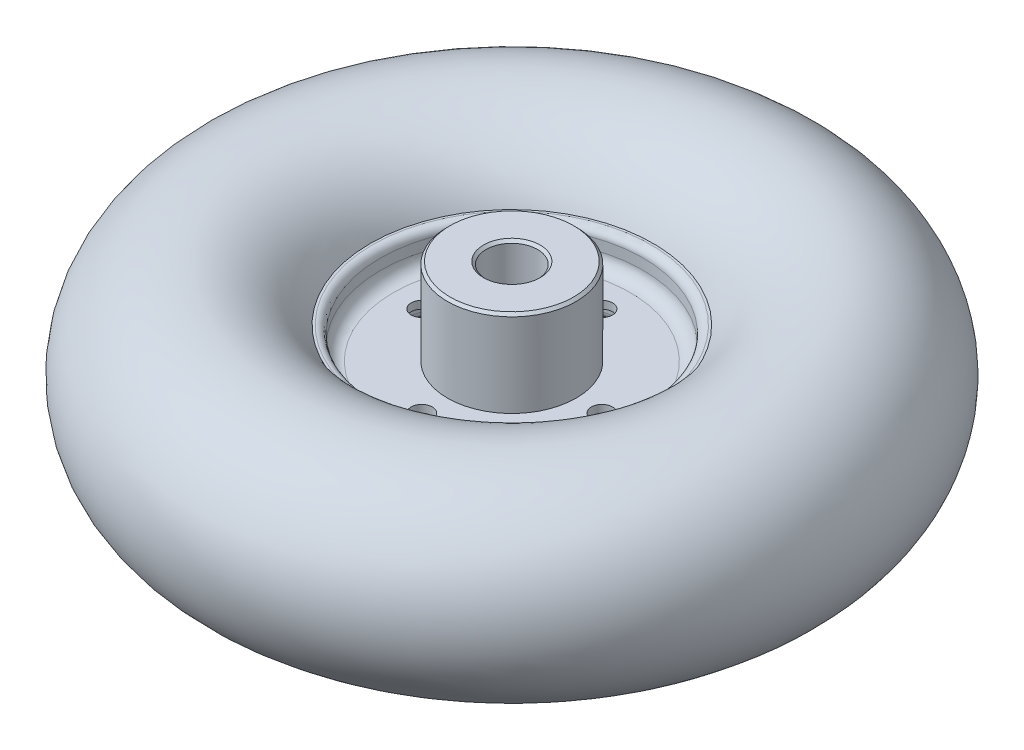
ISO-10303-21;
HEADER;
FILE_DESCRIPTION(('STEP AP214'),'2;1');
FILE_NAME('part.step','',(''),(''),'','','');
FILE_SCHEMA(('AUTOMOTIVE_DESIGN { 1 0 10303 214 1 1 1 1 }'));
ENDSEC;
DATA;
#1=APPLICATION_CONTEXT('core data for automotive mechanical design processes');
#2=APPLICATION_PROTOCOL_DEFINITION('international standard','automotive_design',2000,#1);
#3=PRODUCT_CONTEXT('',#1,'mechanical');
#4=PRODUCT('Part','Part','',(#3));
#5=PRODUCT_RELATED_PRODUCT_CATEGORY('part','',(#4));
#6=PRODUCT_DEFINITION_FORMATION('','',#4);
#7=PRODUCT_DEFINITION_CONTEXT('part definition',#1,'design');
#8=PRODUCT_DEFINITION('design','',#6,#7);
#9=PRODUCT_DEFINITION_SHAPE('','',#8);
#10=(LENGTH_UNIT() NAMED_UNIT(*) SI_UNIT(.MILLI.,.METRE.));
#11=(NAMED_UNIT(*) PLANE_ANGLE_UNIT() SI_UNIT($,.RADIAN.));
#12=(NAMED_UNIT(*) SI_UNIT($,.STERADIAN.) SOLID_ANGLE_UNIT());
#13=UNCERTAINTY_MEASURE_WITH_UNIT(LENGTH_MEASURE(1.E-05),#10,'distance_accuracy_value','');
#14=(GEOMETRIC_REPRESENTATION_CONTEXT(3) GLOBAL_UNCERTAINTY_ASSIGNED_CONTEXT((#13)) GLOBAL_UNIT_ASSIGNED_CONTEXT((#10,
#11,#12)) REPRESENTATION_CONTEXT('',''));
#15=CARTESIAN_POINT('',(0.,0.,0.));
#16=DIRECTION('',(0.,0.,1.));
#17=DIRECTION('',(1.,0.,0.));
#18=AXIS2_PLACEMENT_3D('',#15,#16,#17);
#19=CARTESIAN_POINT('',(0.,-9.86771125565815,0.));
#20=DIRECTION('',(0.,1.,0.));
#21=DIRECTION('',(-1.,0.,0.));
#22=AXIS2_PLACEMENT_3D('',#19,#20,#21);
#23=TOROIDAL_SURFACE('',#22,89.5,38.5);
#24=CARTESIAN_POINT('',(0.,6.94623348181655,0.));
#25=DIRECTION('',(0.,-1.,0.));
#26=DIRECTION('',(-1.,0.,0.));
#27=AXIS2_PLACEMENT_3D('',#24,#25,#26);
#28=CIRCLE('',#27,54.8656057889683);
#29=CARTESIAN_POINT('',(-54.8656057889684,6.94623348181654,0.));
#30=VERTEX_POINT('',#29);
#31=EDGE_CURVE('E85',#30,#30,#28,.T.);
#32=ORIENTED_EDGE('',*,*,#31,.T.);
#33=EDGE_LOOP('',(#32));
#34=FACE_BOUND('',#33,.T.);
#35=CARTESIAN_POINT('',(0.,-23.0537665181834,0.));
#36=DIRECTION('',(0.,-1.,0.));
#37=DIRECTION('',(-1.,0.,0.));
#38=AXIS2_PLACEMENT_3D('',#35,#36,#37);
#39=CIRCLE('',#38,53.3284926134723);
#40=CARTESIAN_POINT('',(-53.3284926134723,-23.0537665181834,0.));
#41=VERTEX_POINT('',#40);
#42=EDGE_CURVE('E82',#41,#41,#39,.T.);
#43=ORIENTED_EDGE('',*,*,#42,.F.);
#44=EDGE_LOOP('',(#43));
#45=FACE_BOUND('',#44,.T.);
#46=ADVANCED_FACE('F35',(#34,#45),#23,.T.);
#47=CARTESIAN_POINT('',(0.,6.94623348181656,0.));
#48=DIRECTION('',(0.,1.,0.));
#49=DIRECTION('',(-1.,0.,0.));
#50=AXIS2_PLACEMENT_3D('',#47,#48,#49);
#51=PLANE('',#50);
#52=CARTESIAN_POINT('',(0.,6.94623348181656,0.));
#53=DIRECTION('',(0.,-1.,0.));
#54=DIRECTION('',(-1.,0.,0.));
#55=AXIS2_PLACEMENT_3D('',#52,#53,#54);
#56=CIRCLE('',#55,54.0000000000001);
#57=CARTESIAN_POINT('',(-54.0000000000001,6.94623348181655,0.));
#58=VERTEX_POINT('',#57);
#59=EDGE_CURVE('E94',#58,#58,#56,.F.);
#60=ORIENTED_EDGE('',*,*,#59,.F.);
#61=EDGE_LOOP('',(#60));
#62=FACE_BOUND('',#61,.T.);
#63=ORIENTED_EDGE('',*,*,#31,.F.);
#64=EDGE_LOOP('',(#63));
#65=FACE_BOUND('',#64,.T.);
#66=ADVANCED_FACE('F147',(#62,#65),#51,.T.);
#67=CARTESIAN_POINT('',(0.,112.941993013574,0.));
#68=DIRECTION('',(0.,1.,0.));
#69=DIRECTION('',(-1.,0.,0.));
#70=AXIS2_PLACEMENT_3D('',#67,#68,#69);
#71=CYLINDRICAL_SURFACE('',#70,51.0000000000001);
#72=CARTESIAN_POINT('',(0.,-0.173002613538517,0.));
#73=DIRECTION('',(0.,-1.,0.));
#74=DIRECTION('',(-1.,0.,0.));
#75=AXIS2_PLACEMENT_3D('',#72,#73,#74);
#76=CIRCLE('',#75,51.0000000000001);
#77=CARTESIAN_POINT('',(-51.0000000000001,-0.173002613538527,0.));
#78=VERTEX_POINT('',#77);
#79=EDGE_CURVE('E81',#78,#78,#76,.F.);
#80=ORIENTED_EDGE('',*,*,#79,.F.);
#81=EDGE_LOOP('',(#80));
#82=FACE_BOUND('',#81,.T.);
#83=CARTESIAN_POINT('',(0.,3.94623348181657,0.));
#84=DIRECTION('',(0.,-1.,0.));
#85=DIRECTION('',(-1.,0.,0.));
#86=AXIS2_PLACEMENT_3D('',#83,#84,#85);
#87=CIRCLE('',#86,51.0000000000001);
#88=CARTESIAN_POINT('',(-51.0000000000001,3.94623348181656,0.));
#89=VERTEX_POINT('',#88);
#90=EDGE_CURVE('E91',#89,#89,#87,.T.);
#91=ORIENTED_EDGE('',*,*,#90,.F.);
#92=EDGE_LOOP('',(#91));
#93=FACE_BOUND('',#92,.T.);
#94=ADVANCED_FACE('F153',(#82,#93),#71,.F.);
#95=CARTESIAN_POINT('',(0.,-5.17300261353851,0.));
#96=DIRECTION('',(0.,1.,0.));
#97=DIRECTION('',(-1.,0.,0.));
#98=AXIS2_PLACEMENT_3D('',#95,#96,#97);
#99=PLANE('',#98);
#100=CARTESIAN_POINT('',(3.67589083805939E-13,-5.17300261353851,-35.));
#101=DIRECTION('',(0.,-1.,0.));
#102=DIRECTION('',(0.,0.,1.));
#103=AXIS2_PLACEMENT_3D('',#100,#101,#102);
#104=CIRCLE('',#103,4.1);
#105=CARTESIAN_POINT('',(3.24643863338169E-13,-5.17300261353851,-30.9));
#106=VERTEX_POINT('',#105);
#107=EDGE_CURVE('E72',#106,#106,#104,.T.);
#108=ORIENTED_EDGE('',*,*,#107,.T.);
#109=EDGE_LOOP('',(#108));
#110=FACE_BOUND('',#109,.T.);
#111=CARTESIAN_POINT('',(-35.,-5.17300261353852,0.));
#112=DIRECTION('',(0.,-1.,0.));
#113=DIRECTION('',(1.,0.,0.));
#114=AXIS2_PLACEMENT_3D('',#111,#112,#113);
#115=CIRCLE('',#114,4.1);
#116=CARTESIAN_POINT('',(-30.9,-5.17300261353852,0.));
#117=VERTEX_POINT('',#116);
#118=EDGE_CURVE('E62',#117,#117,#115,.T.);
#119=ORIENTED_EDGE('',*,*,#118,.T.);
#120=EDGE_LOOP('',(#119));
#121=FACE_BOUND('',#120,.T.);
#122=CARTESIAN_POINT('',(-1.21218303632099E-13,-5.17300261353851,35.));
#123=DIRECTION('',(0.,-1.,0.));
#124=DIRECTION('',(0.,0.,-1.));
#125=AXIS2_PLACEMENT_3D('',#122,#123,#124);
#126=CIRCLE('',#125,4.1);
#127=CARTESIAN_POINT('',(-1.06903230142842E-13,-5.17300261353851,30.9));
#128=VERTEX_POINT('',#127);
#129=EDGE_CURVE('E59',#128,#128,#126,.T.);
#130=ORIENTED_EDGE('',*,*,#129,.T.);
#131=EDGE_LOOP('',(#130));
#132=FACE_BOUND('',#131,.T.);
#133=CARTESIAN_POINT('',(35.,-5.17300261353851,0.));
#134=DIRECTION('',(0.,-1.,0.));
#135=DIRECTION('',(-1.,0.,0.));
#136=AXIS2_PLACEMENT_3D('',#133,#134,#135);
#137=CIRCLE('',#136,4.1);
#138=CARTESIAN_POINT('',(30.9,-5.17300261353851,0.));
#139=VERTEX_POINT('',#138);
#140=EDGE_CURVE('E56',#139,#139,#137,.T.);
#141=ORIENTED_EDGE('',*,*,#140,.T.);
#142=EDGE_LOOP('',(#141));
#143=FACE_BOUND('',#142,.T.);
#144=CARTESIAN_POINT('',(0.,-5.17300261353851,0.));
#145=DIRECTION('',(0.,-1.,0.));
#146=DIRECTION('',(-1.,0.,0.));
#147=AXIS2_PLACEMENT_3D('',#144,#145,#146);
#148=CIRCLE('',#147,25.);
#149=CARTESIAN_POINT('',(-25.,-5.17300261353852,0.));
#150=VERTEX_POINT('',#149);
#151=EDGE_CURVE('E77',#150,#150,#148,.T.);
#152=ORIENTED_EDGE('',*,*,#151,.T.);
#153=EDGE_LOOP('',(#152));
#154=FACE_BOUND('',#153,.T.);
#155=CARTESIAN_POINT('',(0.,-5.17300261353851,0.));
#156=DIRECTION('',(0.,-1.,0.));
#157=DIRECTION('',(-1.,0.,0.));
#158=AXIS2_PLACEMENT_3D('',#155,#156,#157);
#159=CIRCLE('',#158,46.0000000000001);
#160=CARTESIAN_POINT('',(-46.0000000000001,-5.17300261353852,0.));
#161=VERTEX_POINT('',#160);
#162=EDGE_CURVE('E103',#161,#161,#159,.T.);
#163=ORIENTED_EDGE('',*,*,#162,.F.);
#164=EDGE_LOOP('',(#163));
#165=FACE_BOUND('',#164,.T.);
#166=ADVANCED_FACE('F200',(#110,#121,#132,#143,#154,#165),#99,.T.);
#167=CARTESIAN_POINT('',(0.,-8.17300261353851,0.));
#168=DIRECTION('',(0.,1.,0.));
#169=DIRECTION('',(-1.,0.,0.));
#170=AXIS2_PLACEMENT_3D('',#167,#168,#169);
#171=PLANE('',#170);
#172=CARTESIAN_POINT('',(3.68159473945413E-13,-8.17300261353851,-35.));
#173=DIRECTION('',(0.,-1.,0.));
#174=DIRECTION('',(-1.,0.,0.));
#175=AXIS2_PLACEMENT_3D('',#172,#173,#174);
#176=CIRCLE('',#175,4.1);
#177=CARTESIAN_POINT('',(-4.09999999999963,-8.17300261353851,-35.));
#178=VERTEX_POINT('',#177);
#179=EDGE_CURVE('E39',#178,#178,#176,.T.);
#180=ORIENTED_EDGE('',*,*,#179,.F.);
#181=EDGE_LOOP('',(#180));
#182=FACE_BOUND('',#181,.T.);
#183=CARTESIAN_POINT('',(-35.,-8.17300261353852,0.));
#184=DIRECTION('',(0.,-1.,0.));
#185=DIRECTION('',(-1.,0.,0.));
#186=AXIS2_PLACEMENT_3D('',#183,#184,#185);
#187=CIRCLE('',#186,4.1);
#188=CARTESIAN_POINT('',(-39.1,-8.17300261353852,0.));
#189=VERTEX_POINT('',#188);
#190=EDGE_CURVE('E60',#189,#189,#187,.T.);
#191=ORIENTED_EDGE('',*,*,#190,.F.);
#192=EDGE_LOOP('',(#191));
#193=FACE_BOUND('',#192,.T.);
#194=CARTESIAN_POINT('',(-1.20647913492626E-13,-8.17300261353851,35.));
#195=DIRECTION('',(0.,-1.,0.));
#196=DIRECTION('',(-1.,0.,0.));
#197=AXIS2_PLACEMENT_3D('',#194,#195,#196);
#198=CIRCLE('',#197,4.1);
#199=CARTESIAN_POINT('',(-4.10000000000012,-8.17300261353851,35.));
#200=VERTEX_POINT('',#199);
#201=EDGE_CURVE('E57',#200,#200,#198,.T.);
#202=ORIENTED_EDGE('',*,*,#201,.F.);
#203=EDGE_LOOP('',(#202));
#204=FACE_BOUND('',#203,.T.);
#205=CARTESIAN_POINT('',(35.,-8.17300261353851,0.));
#206=DIRECTION('',(0.,-1.,0.));
#207=DIRECTION('',(-1.,0.,0.));
#208=AXIS2_PLACEMENT_3D('',#205,#206,#207);
#209=CIRCLE('',#208,4.1);
#210=CARTESIAN_POINT('',(30.9,-8.17300261353851,0.));
#211=VERTEX_POINT('',#210);
#212=EDGE_CURVE('E52',#211,#211,#209,.T.);
#213=ORIENTED_EDGE('',*,*,#212,.F.);
#214=EDGE_LOOP('',(#213));
#215=FACE_BOUND('',#214,.T.);
#216=CARTESIAN_POINT('',(0.,-8.17300261353851,0.));
#217=DIRECTION('',(0.,-1.,0.));
#218=DIRECTION('',(-1.,0.,0.));
#219=AXIS2_PLACEMENT_3D('',#216,#217,#218);
#220=CIRCLE('',#219,25.);
#221=CARTESIAN_POINT('',(-25.,-8.17300261353852,0.));
#222=VERTEX_POINT('',#221);
#223=EDGE_CURVE('E55',#222,#222,#220,.T.);
#224=ORIENTED_EDGE('',*,*,#223,.F.);
#225=EDGE_LOOP('',(#224));
#226=FACE_BOUND('',#225,.T.);
#227=CARTESIAN_POINT('',(0.,-8.17300261353851,0.));
#228=DIRECTION('',(0.,-1.,0.));
#229=DIRECTION('',(-1.,0.,0.));
#230=AXIS2_PLACEMENT_3D('',#227,#228,#229);
#231=CIRCLE('',#230,46.0000000000001);
#232=CARTESIAN_POINT('',(-46.0000000000001,-8.17300261353852,0.));
#233=VERTEX_POINT('',#232);
#234=EDGE_CURVE('E100',#233,#233,#231,.F.);
#235=ORIENTED_EDGE('',*,*,#234,.F.);
#236=EDGE_LOOP('',(#235));
#237=FACE_BOUND('',#236,.T.);
#238=ADVANCED_FACE('F198',(#182,#193,#204,#215,#226,#237),#171,.F.);
#239=CARTESIAN_POINT('',(0.,-13.1730026135385,0.));
#240=DIRECTION('',(0.,-1.,0.));
#241=DIRECTION('',(-1.,0.,0.));
#242=AXIS2_PLACEMENT_3D('',#239,#240,#241);
#243=CIRCLE('',#242,51.0000000000001);
#244=CARTESIAN_POINT('',(-51.0000000000001,-13.1730026135385,0.));
#245=VERTEX_POINT('',#244);
#246=EDGE_CURVE('E97',#245,#245,#243,.T.);
#247=ORIENTED_EDGE('',*,*,#246,.F.);
#248=EDGE_LOOP('',(#247));
#249=FACE_BOUND('',#248,.T.);
#250=CARTESIAN_POINT('',(0.,-20.1298859067633,0.));
#251=DIRECTION('',(0.,1.,0.));
#252=DIRECTION('',(1.,0.,0.));
#253=AXIS2_PLACEMENT_3D('',#250,#251,#252);
#254=CIRCLE('',#253,51.0000000000001);
#255=CARTESIAN_POINT('',(51.,-20.1298859067633,0.));
#256=VERTEX_POINT('',#255);
#257=EDGE_CURVE('E88',#256,#256,#254,.T.);
#258=ORIENTED_EDGE('',*,*,#257,.F.);
#259=EDGE_LOOP('',(#258));
#260=FACE_BOUND('',#259,.T.);
#261=ADVANCED_FACE('F163',(#249,#260),#71,.F.);
#262=CARTESIAN_POINT('',(0.,-20.1298859067633,0.));
#263=DIRECTION('',(0.,-1.,0.));
#264=DIRECTION('',(1.,0.,0.));
#265=AXIS2_PLACEMENT_3D('',#262,#263,#264);
#266=TOROIDAL_SURFACE('',#265,54.0000000000001,3.);
#267=ORIENTED_EDGE('',*,*,#257,.T.);
#268=EDGE_LOOP('',(#267));
#269=FACE_BOUND('',#268,.T.);
#270=ORIENTED_EDGE('',*,*,#42,.T.);
#271=EDGE_LOOP('',(#270));
#272=FACE_BOUND('',#271,.T.);
#273=ADVANCED_FACE('F159',(#269,#272),#266,.T.);
#274=CARTESIAN_POINT('',(0.,3.94623348181657,0.));
#275=DIRECTION('',(0.,1.,0.));
#276=DIRECTION('',(-1.,0.,0.));
#277=AXIS2_PLACEMENT_3D('',#274,#275,#276);
#278=TOROIDAL_SURFACE('',#277,54.0000000000001,3.);
#279=ORIENTED_EDGE('',*,*,#59,.T.);
#280=EDGE_LOOP('',(#279));
#281=FACE_BOUND('',#280,.T.);
#282=ORIENTED_EDGE('',*,*,#90,.T.);
#283=EDGE_LOOP('',(#282));
#284=FACE_BOUND('',#283,.T.);
#285=ADVANCED_FACE('F162',(#281,#284),#278,.T.);
#286=CARTESIAN_POINT('',(0.,-13.1730026135385,0.));
#287=DIRECTION('',(0.,1.,0.));
#288=DIRECTION('',(-1.,0.,0.));
#289=AXIS2_PLACEMENT_3D('',#286,#287,#288);
#290=TOROIDAL_SURFACE('',#289,46.0000000000001,5.);
#291=ORIENTED_EDGE('',*,*,#234,.T.);
#292=EDGE_LOOP('',(#291));
#293=FACE_BOUND('',#292,.T.);
#294=ORIENTED_EDGE('',*,*,#246,.T.);
#295=EDGE_LOOP('',(#294));
#296=FACE_BOUND('',#295,.T.);
#297=ADVANCED_FACE('F167',(#293,#296),#290,.F.);
#298=CARTESIAN_POINT('',(0.,-0.173002613538517,0.));
#299=DIRECTION('',(0.,1.,0.));
#300=DIRECTION('',(-1.,0.,0.));
#301=AXIS2_PLACEMENT_3D('',#298,#299,#300);
#302=TOROIDAL_SURFACE('',#301,46.0000000000001,5.);
#303=ORIENTED_EDGE('',*,*,#79,.T.);
#304=EDGE_LOOP('',(#303));
#305=FACE_BOUND('',#304,.T.);
#306=ORIENTED_EDGE('',*,*,#162,.T.);
#307=EDGE_LOOP('',(#306));
#308=FACE_BOUND('',#307,.T.);
#309=ADVANCED_FACE('F171',(#305,#308),#302,.F.);
#310=CARTESIAN_POINT('',(0.,28.3269973864615,0.));
#311=DIRECTION('',(0.,-1.,0.));
#312=DIRECTION('',(1.,0.,0.));
#313=AXIS2_PLACEMENT_3D('',#310,#311,#312);
#314=CYLINDRICAL_SURFACE('',#313,25.);
#315=CARTESIAN_POINT('',(0.,-40.6730026135385,0.));
#316=DIRECTION('',(0.,1.,0.));
#317=DIRECTION('',(1.,0.,0.));
#318=AXIS2_PLACEMENT_3D('',#315,#316,#317);
#319=CIRCLE('',#318,25.);
#320=CARTESIAN_POINT('',(25.,-40.6730026135385,0.));
#321=VERTEX_POINT('',#320);
#322=EDGE_CURVE('E121',#321,#321,#319,.F.);
#323=ORIENTED_EDGE('',*,*,#322,.F.);
#324=EDGE_LOOP('',(#323));
#325=FACE_BOUND('',#324,.T.);
#326=ORIENTED_EDGE('',*,*,#223,.T.);
#327=EDGE_LOOP('',(#326));
#328=FACE_BOUND('',#327,.T.);
#329=ADVANCED_FACE('F143',(#325,#328),#314,.T.);
#330=CARTESIAN_POINT('',(0.,-41.6730026135385,0.));
#331=DIRECTION('',(0.,-1.,0.));
#332=DIRECTION('',(1.,0.,0.));
#333=AXIS2_PLACEMENT_3D('',#330,#331,#332);
#334=PLANE('',#333);
#335=CARTESIAN_POINT('',(0.,-41.6730026135385,0.));
#336=DIRECTION('',(0.,1.,0.));
#337=DIRECTION('',(1.,0.,0.));
#338=AXIS2_PLACEMENT_3D('',#335,#336,#337);
#339=CIRCLE('',#338,11.);
#340=CARTESIAN_POINT('',(11.,-41.6730026135385,0.));
#341=VERTEX_POINT('',#340);
#342=EDGE_CURVE('E118',#341,#341,#339,.F.);
#343=ORIENTED_EDGE('',*,*,#342,.F.);
#344=EDGE_LOOP('',(#343));
#345=FACE_BOUND('',#344,.T.);
#346=CARTESIAN_POINT('',(0.,-41.6730026135385,0.));
#347=DIRECTION('',(0.,1.,0.));
#348=DIRECTION('',(1.,0.,0.));
#349=AXIS2_PLACEMENT_3D('',#346,#347,#348);
#350=CIRCLE('',#349,24.);
#351=CARTESIAN_POINT('',(23.9999999999999,-41.6730026135385,0.));
#352=VERTEX_POINT('',#351);
#353=EDGE_CURVE('E115',#352,#352,#350,.T.);
#354=ORIENTED_EDGE('',*,*,#353,.F.);
#355=EDGE_LOOP('',(#354));
#356=FACE_BOUND('',#355,.T.);
#357=ADVANCED_FACE('F189',(#345,#356),#334,.T.);
#358=CARTESIAN_POINT('',(0.,112.941993013574,0.));
#359=DIRECTION('',(0.,1.,0.));
#360=DIRECTION('',(-1.,0.,0.));
#361=AXIS2_PLACEMENT_3D('',#358,#359,#360);
#362=CYLINDRICAL_SURFACE('',#361,10.);
#363=CARTESIAN_POINT('',(0.,-40.6730026135386,0.));
#364=DIRECTION('',(0.,1.,0.));
#365=DIRECTION('',(1.,0.,0.));
#366=AXIS2_PLACEMENT_3D('',#363,#364,#365);
#367=CIRCLE('',#366,10.);
#368=CARTESIAN_POINT('',(10.,-40.6730026135386,0.));
#369=VERTEX_POINT('',#368);
#370=EDGE_CURVE('E112',#369,#369,#367,.T.);
#371=ORIENTED_EDGE('',*,*,#370,.F.);
#372=EDGE_LOOP('',(#371));
#373=FACE_BOUND('',#372,.T.);
#374=CARTESIAN_POINT('',(0.,27.3269973864615,0.));
#375=DIRECTION('',(0.,1.,0.));
#376=DIRECTION('',(1.,0.,0.));
#377=AXIS2_PLACEMENT_3D('',#374,#375,#376);
#378=CIRCLE('',#377,10.);
#379=CARTESIAN_POINT('',(10.,27.3269973864615,0.));
#380=VERTEX_POINT('',#379);
#381=EDGE_CURVE('E80',#380,#380,#378,.F.);
#382=ORIENTED_EDGE('',*,*,#381,.F.);
#383=EDGE_LOOP('',(#382));
#384=FACE_BOUND('',#383,.T.);
#385=ADVANCED_FACE('F140',(#373,#384),#362,.F.);
#386=CARTESIAN_POINT('',(0.,27.3269973864615,0.));
#387=DIRECTION('',(0.,1.,0.));
#388=DIRECTION('',(1.,0.,0.));
#389=AXIS2_PLACEMENT_3D('',#386,#387,#388);
#390=CIRCLE('',#389,25.);
#391=CARTESIAN_POINT('',(25.,27.3269973864615,0.));
#392=VERTEX_POINT('',#391);
#393=EDGE_CURVE('E10',#392,#392,#390,.T.);
#394=ORIENTED_EDGE('',*,*,#393,.F.);
#395=EDGE_LOOP('',(#394));
#396=FACE_BOUND('',#395,.T.);
#397=ORIENTED_EDGE('',*,*,#151,.F.);
#398=EDGE_LOOP('',(#397));
#399=FACE_BOUND('',#398,.T.);
#400=ADVANCED_FACE('F130',(#396,#399),#314,.T.);
#401=CARTESIAN_POINT('',(0.,28.3269973864615,0.));
#402=DIRECTION('',(0.,-1.,0.));
#403=DIRECTION('',(1.,0.,0.));
#404=AXIS2_PLACEMENT_3D('',#401,#402,#403);
#405=PLANE('',#404);
#406=CARTESIAN_POINT('',(0.,28.3269973864615,0.));
#407=DIRECTION('',(0.,1.,0.));
#408=DIRECTION('',(1.,0.,0.));
#409=AXIS2_PLACEMENT_3D('',#406,#407,#408);
#410=CIRCLE('',#409,11.0000000000001);
#411=CARTESIAN_POINT('',(11.0000000000001,28.3269973864615,0.));
#412=VERTEX_POINT('',#411);
#413=EDGE_CURVE('E43',#412,#412,#410,.T.);
#414=ORIENTED_EDGE('',*,*,#413,.F.);
#415=EDGE_LOOP('',(#414));
#416=FACE_BOUND('',#415,.T.);
#417=CARTESIAN_POINT('',(0.,28.3269973864615,0.));
#418=DIRECTION('',(0.,1.,0.));
#419=DIRECTION('',(1.,0.,0.));
#420=AXIS2_PLACEMENT_3D('',#417,#418,#419);
#421=CIRCLE('',#420,23.9999999999999);
#422=CARTESIAN_POINT('',(23.9999999999999,28.3269973864615,0.));
#423=VERTEX_POINT('',#422);
#424=EDGE_CURVE('E48',#423,#423,#421,.F.);
#425=ORIENTED_EDGE('',*,*,#424,.F.);
#426=EDGE_LOOP('',(#425));
#427=FACE_BOUND('',#426,.T.);
#428=ADVANCED_FACE('F127',(#416,#427),#405,.F.);
#429=CARTESIAN_POINT('',(0.,-40.6730026135386,0.));
#430=DIRECTION('',(0.,-1.,0.));
#431=DIRECTION('',(1.,0.,0.));
#432=AXIS2_PLACEMENT_3D('',#429,#430,#431);
#433=CONICAL_SURFACE('',#432,10.,0.785398163397447);
#434=ORIENTED_EDGE('',*,*,#342,.T.);
#435=EDGE_LOOP('',(#434));
#436=FACE_BOUND('',#435,.T.);
#437=ORIENTED_EDGE('',*,*,#370,.T.);
#438=EDGE_LOOP('',(#437));
#439=FACE_BOUND('',#438,.T.);
#440=ADVANCED_FACE('F129',(#436,#439),#433,.F.);
#441=CARTESIAN_POINT('',(0.,-41.6730026135385,0.));
#442=DIRECTION('',(0.,1.,0.));
#443=DIRECTION('',(-1.,0.,0.));
#444=AXIS2_PLACEMENT_3D('',#441,#442,#443);
#445=CONICAL_SURFACE('',#444,24.,0.785398163397459);
#446=ORIENTED_EDGE('',*,*,#322,.T.);
#447=EDGE_LOOP('',(#446));
#448=FACE_BOUND('',#447,.T.);
#449=ORIENTED_EDGE('',*,*,#353,.T.);
#450=EDGE_LOOP('',(#449));
#451=FACE_BOUND('',#450,.T.);
#452=ADVANCED_FACE('F137',(#448,#451),#445,.T.);
#453=CARTESIAN_POINT('',(0.,28.3269973864615,0.));
#454=DIRECTION('',(0.,1.,0.));
#455=DIRECTION('',(-1.,0.,0.));
#456=AXIS2_PLACEMENT_3D('',#453,#454,#455);
#457=CONICAL_SURFACE('',#456,11.0000000000001,0.785398163397467);
#458=ORIENTED_EDGE('',*,*,#381,.T.);
#459=EDGE_LOOP('',(#458));
#460=FACE_BOUND('',#459,.T.);
#461=ORIENTED_EDGE('',*,*,#413,.T.);
#462=EDGE_LOOP('',(#461));
#463=FACE_BOUND('',#462,.T.);
#464=ADVANCED_FACE('F177',(#460,#463),#457,.F.);
#465=CARTESIAN_POINT('',(0.,27.3269973864615,0.));
#466=DIRECTION('',(0.,-1.,0.));
#467=DIRECTION('',(1.,0.,0.));
#468=AXIS2_PLACEMENT_3D('',#465,#466,#467);
#469=CONICAL_SURFACE('',#468,25.,0.785398163397464);
#470=ORIENTED_EDGE('',*,*,#424,.T.);
#471=EDGE_LOOP('',(#470));
#472=FACE_BOUND('',#471,.T.);
#473=ORIENTED_EDGE('',*,*,#393,.T.);
#474=EDGE_LOOP('',(#473));
#475=FACE_BOUND('',#474,.T.);
#476=ADVANCED_FACE('F37',(#472,#475),#469,.T.);
#477=CARTESIAN_POINT('',(35.,-15.1730026135385,0.));
#478=DIRECTION('',(0.,1.,0.));
#479=DIRECTION('',(-1.,0.,0.));
#480=AXIS2_PLACEMENT_3D('',#477,#478,#479);
#481=CYLINDRICAL_SURFACE('',#480,4.1);
#482=ORIENTED_EDGE('',*,*,#140,.F.);
#483=EDGE_LOOP('',(#482));
#484=FACE_BOUND('',#483,.T.);
#485=ORIENTED_EDGE('',*,*,#212,.T.);
#486=EDGE_LOOP('',(#485));
#487=FACE_BOUND('',#486,.T.);
#488=ADVANCED_FACE('F184',(#484,#487),#481,.F.);
#489=CARTESIAN_POINT('',(-1.19317003167188E-13,-15.1730026135385,35.));
#490=DIRECTION('',(0.,1.,0.));
#491=DIRECTION('',(-1.,0.,0.));
#492=AXIS2_PLACEMENT_3D('',#489,#490,#491);
#493=CYLINDRICAL_SURFACE('',#492,4.1);
#494=ORIENTED_EDGE('',*,*,#129,.F.);
#495=EDGE_LOOP('',(#494));
#496=FACE_BOUND('',#495,.T.);
#497=ORIENTED_EDGE('',*,*,#201,.T.);
#498=EDGE_LOOP('',(#497));
#499=FACE_BOUND('',#498,.T.);
#500=ADVANCED_FACE('F224',(#496,#499),#493,.F.);
#501=CARTESIAN_POINT('',(-35.,-15.1730026135385,0.));
#502=DIRECTION('',(0.,1.,0.));
#503=DIRECTION('',(-1.,0.,0.));
#504=AXIS2_PLACEMENT_3D('',#501,#502,#503);
#505=CYLINDRICAL_SURFACE('',#504,4.1);
#506=ORIENTED_EDGE('',*,*,#118,.F.);
#507=EDGE_LOOP('',(#506));
#508=FACE_BOUND('',#507,.T.);
#509=ORIENTED_EDGE('',*,*,#190,.T.);
#510=EDGE_LOOP('',(#509));
#511=FACE_BOUND('',#510,.T.);
#512=ADVANCED_FACE('F322',(#508,#511),#505,.F.);
#513=CARTESIAN_POINT('',(3.6949038427085E-13,-15.1730026135385,-35.));
#514=DIRECTION('',(0.,1.,0.));
#515=DIRECTION('',(-1.,0.,0.));
#516=AXIS2_PLACEMENT_3D('',#513,#514,#515);
#517=CYLINDRICAL_SURFACE('',#516,4.1);
#518=ORIENTED_EDGE('',*,*,#107,.F.);
#519=EDGE_LOOP('',(#518));
#520=FACE_BOUND('',#519,.T.);
#521=ORIENTED_EDGE('',*,*,#179,.T.);
#522=EDGE_LOOP('',(#521));
#523=FACE_BOUND('',#522,.T.);
#524=ADVANCED_FACE('F332',(#520,#523),#517,.F.);
#525=CLOSED_SHELL('',(#46,#66,#94,#166,#238,#261,#273,#285,#297,#309,#329,#357,#385,#400,#428,
#440,#452,#464,#476,#488,#500,#512,#524));
#526=MANIFOLD_SOLID_BREP('B2',#525);
#527=ADVANCED_BREP_SHAPE_REPRESENTATION('',(#18,#526),#14);
#528=SHAPE_DEFINITION_REPRESENTATION(#9,#527);
ENDSEC;
END-ISO-10303-21;
